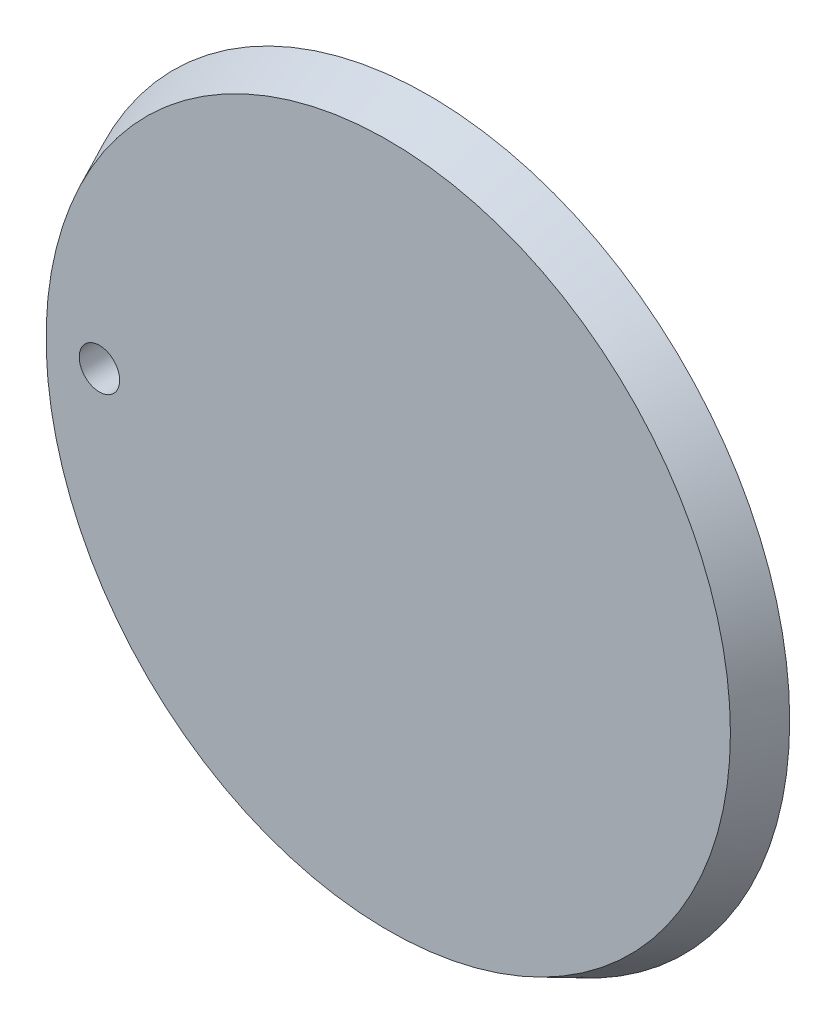
ISO-10303-21;
HEADER;
FILE_DESCRIPTION(('STEP AP214'),'2;1');
FILE_NAME('part.step','',(''),(''),'','','');
FILE_SCHEMA(('AUTOMOTIVE_DESIGN { 1 0 10303 214 1 1 1 1 }'));
ENDSEC;
DATA;
#1=APPLICATION_CONTEXT('core data for automotive mechanical design processes');
#2=APPLICATION_PROTOCOL_DEFINITION('international standard','automotive_design',2000,#1);
#3=PRODUCT_CONTEXT('',#1,'mechanical');
#4=PRODUCT('Part','Part','',(#3));
#5=PRODUCT_RELATED_PRODUCT_CATEGORY('part','',(#4));
#6=PRODUCT_DEFINITION_FORMATION('','',#4);
#7=PRODUCT_DEFINITION_CONTEXT('part definition',#1,'design');
#8=PRODUCT_DEFINITION('design','',#6,#7);
#9=PRODUCT_DEFINITION_SHAPE('','',#8);
#10=(LENGTH_UNIT() NAMED_UNIT(*) SI_UNIT(.MILLI.,.METRE.));
#11=(NAMED_UNIT(*) PLANE_ANGLE_UNIT() SI_UNIT($,.RADIAN.));
#12=(NAMED_UNIT(*) SI_UNIT($,.STERADIAN.) SOLID_ANGLE_UNIT());
#13=UNCERTAINTY_MEASURE_WITH_UNIT(LENGTH_MEASURE(1.E-05),#10,'distance_accuracy_value','');
#14=(GEOMETRIC_REPRESENTATION_CONTEXT(3) GLOBAL_UNCERTAINTY_ASSIGNED_CONTEXT((#13)) GLOBAL_UNIT_ASSIGNED_CONTEXT((#10,
#11,#12)) REPRESENTATION_CONTEXT('',''));
#15=CARTESIAN_POINT('',(0.,0.,0.));
#16=DIRECTION('',(0.,0.,1.));
#17=DIRECTION('',(1.,0.,0.));
#18=AXIS2_PLACEMENT_3D('',#15,#16,#17);
#19=CARTESIAN_POINT('',(0.,0.,-14.));
#20=DIRECTION('',(0.,0.,1.));
#21=DIRECTION('',(1.,0.,0.));
#22=AXIS2_PLACEMENT_3D('',#19,#20,#21);
#23=CYLINDRICAL_SURFACE('',#22,25.);
#24=CARTESIAN_POINT('',(0.,0.,-14.));
#25=DIRECTION('',(0.,0.,1.));
#26=DIRECTION('',(1.,0.,0.));
#27=AXIS2_PLACEMENT_3D('',#24,#25,#26);
#28=CIRCLE('',#27,25.);
#29=CARTESIAN_POINT('',(25.,0.,-14.));
#30=VERTEX_POINT('',#29);
#31=EDGE_CURVE('E10',#30,#30,#28,.T.);
#32=ORIENTED_EDGE('',*,*,#31,.T.);
#33=EDGE_LOOP('',(#32));
#34=FACE_BOUND('',#33,.T.);
#35=CARTESIAN_POINT('',(0.,0.,10.));
#36=DIRECTION('',(0.,0.,1.));
#37=DIRECTION('',(1.,0.,0.));
#38=AXIS2_PLACEMENT_3D('',#35,#36,#37);
#39=CIRCLE('',#38,25.);
#40=CARTESIAN_POINT('',(25.,0.,10.));
#41=VERTEX_POINT('',#40);
#42=EDGE_CURVE('E37',#41,#41,#39,.T.);
#43=ORIENTED_EDGE('',*,*,#42,.F.);
#44=EDGE_LOOP('',(#43));
#45=FACE_BOUND('',#44,.T.);
#46=ADVANCED_FACE('F31',(#34,#45),#23,.T.);
#47=CARTESIAN_POINT('',(0.,0.,-14.));
#48=DIRECTION('',(0.,0.,1.));
#49=DIRECTION('',(1.,0.,0.));
#50=AXIS2_PLACEMENT_3D('',#47,#48,#49);
#51=PLANE('',#50);
#52=ORIENTED_EDGE('',*,*,#31,.F.);
#53=EDGE_LOOP('',(#52));
#54=FACE_BOUND('',#53,.T.);
#55=ADVANCED_FACE('F75',(#54),#51,.F.);
#56=CARTESIAN_POINT('',(0.,0.,10.));
#57=DIRECTION('',(0.,0.,-1.));
#58=DIRECTION('',(1.,0.,0.));
#59=AXIS2_PLACEMENT_3D('',#56,#57,#58);
#60=CONICAL_SURFACE('',#59,62.5,0.436332312998583);
#61=CARTESIAN_POINT('',(0.,0.,17.));
#62=DIRECTION('',(0.,0.,1.));
#63=DIRECTION('',(1.,0.,0.));
#64=AXIS2_PLACEMENT_3D('',#61,#62,#63);
#65=CIRCLE('',#64,59.235846392915);
#66=CARTESIAN_POINT('',(59.235846392915,0.,17.));
#67=VERTEX_POINT('',#66);
#68=EDGE_CURVE('E41',#67,#67,#65,.T.);
#69=ORIENTED_EDGE('',*,*,#68,.F.);
#70=EDGE_LOOP('',(#69));
#71=FACE_BOUND('',#70,.T.);
#72=CARTESIAN_POINT('',(0.,0.,10.));
#73=DIRECTION('',(0.,0.,1.));
#74=DIRECTION('',(1.,0.,0.));
#75=AXIS2_PLACEMENT_3D('',#72,#73,#74);
#76=CIRCLE('',#75,62.5);
#77=CARTESIAN_POINT('',(62.5,0.,10.));
#78=VERTEX_POINT('',#77);
#79=EDGE_CURVE('E45',#78,#78,#76,.T.);
#80=ORIENTED_EDGE('',*,*,#79,.T.);
#81=EDGE_LOOP('',(#80));
#82=FACE_BOUND('',#81,.T.);
#83=ADVANCED_FACE('F69',(#71,#82),#60,.T.);
#84=CARTESIAN_POINT('',(0.,0.,17.));
#85=DIRECTION('',(0.,0.,1.));
#86=DIRECTION('',(1.,0.,0.));
#87=AXIS2_PLACEMENT_3D('',#84,#85,#86);
#88=PLANE('',#87);
#89=CARTESIAN_POINT('',(-50.,0.,17.));
#90=DIRECTION('',(0.,0.,1.));
#91=DIRECTION('',(1.,0.,0.));
#92=AXIS2_PLACEMENT_3D('',#89,#90,#91);
#93=CIRCLE('',#92,3.5);
#94=CARTESIAN_POINT('',(-46.5,0.,17.));
#95=VERTEX_POINT('',#94);
#96=EDGE_CURVE('E51',#95,#95,#93,.T.);
#97=ORIENTED_EDGE('',*,*,#96,.F.);
#98=EDGE_LOOP('',(#97));
#99=FACE_BOUND('',#98,.T.);
#100=ORIENTED_EDGE('',*,*,#68,.T.);
#101=EDGE_LOOP('',(#100));
#102=FACE_BOUND('',#101,.T.);
#103=ADVANCED_FACE('F66',(#99,#102),#88,.T.);
#104=CARTESIAN_POINT('',(0.,0.,10.));
#105=DIRECTION('',(0.,0.,1.));
#106=DIRECTION('',(1.,0.,0.));
#107=AXIS2_PLACEMENT_3D('',#104,#105,#106);
#108=PLANE('',#107);
#109=ORIENTED_EDGE('',*,*,#42,.T.);
#110=EDGE_LOOP('',(#109));
#111=FACE_BOUND('',#110,.T.);
#112=ORIENTED_EDGE('',*,*,#79,.F.);
#113=EDGE_LOOP('',(#112));
#114=FACE_BOUND('',#113,.T.);
#115=ADVANCED_FACE('F62',(#111,#114),#108,.F.);
#116=CARTESIAN_POINT('',(-50.,0.,12.));
#117=DIRECTION('',(0.,0.,1.));
#118=DIRECTION('',(1.,0.,0.));
#119=AXIS2_PLACEMENT_3D('',#116,#117,#118);
#120=CYLINDRICAL_SURFACE('',#119,3.5);
#121=CARTESIAN_POINT('',(-50.,0.,12.));
#122=DIRECTION('',(0.,0.,1.));
#123=DIRECTION('',(1.,0.,0.));
#124=AXIS2_PLACEMENT_3D('',#121,#122,#123);
#125=CIRCLE('',#124,3.5);
#126=CARTESIAN_POINT('',(-46.5,0.,12.));
#127=VERTEX_POINT('',#126);
#128=EDGE_CURVE('E50',#127,#127,#125,.T.);
#129=ORIENTED_EDGE('',*,*,#128,.F.);
#130=EDGE_LOOP('',(#129));
#131=FACE_BOUND('',#130,.T.);
#132=ORIENTED_EDGE('',*,*,#96,.T.);
#133=EDGE_LOOP('',(#132));
#134=FACE_BOUND('',#133,.T.);
#135=ADVANCED_FACE('F59',(#131,#134),#120,.F.);
#136=CARTESIAN_POINT('',(-50.,0.,12.));
#137=DIRECTION('',(0.,0.,1.));
#138=DIRECTION('',(1.,0.,0.));
#139=AXIS2_PLACEMENT_3D('',#136,#137,#138);
#140=PLANE('',#139);
#141=ORIENTED_EDGE('',*,*,#128,.T.);
#142=EDGE_LOOP('',(#141));
#143=FACE_BOUND('',#142,.T.);
#144=ADVANCED_FACE('F57',(#143),#140,.T.);
#145=CLOSED_SHELL('',(#46,#55,#83,#103,#115,#135,#144));
#146=MANIFOLD_SOLID_BREP('B2',#145);
#147=ADVANCED_BREP_SHAPE_REPRESENTATION('',(#18,#146),#14);
#148=SHAPE_DEFINITION_REPRESENTATION(#9,#147);
ENDSEC;
END-ISO-10303-21;
